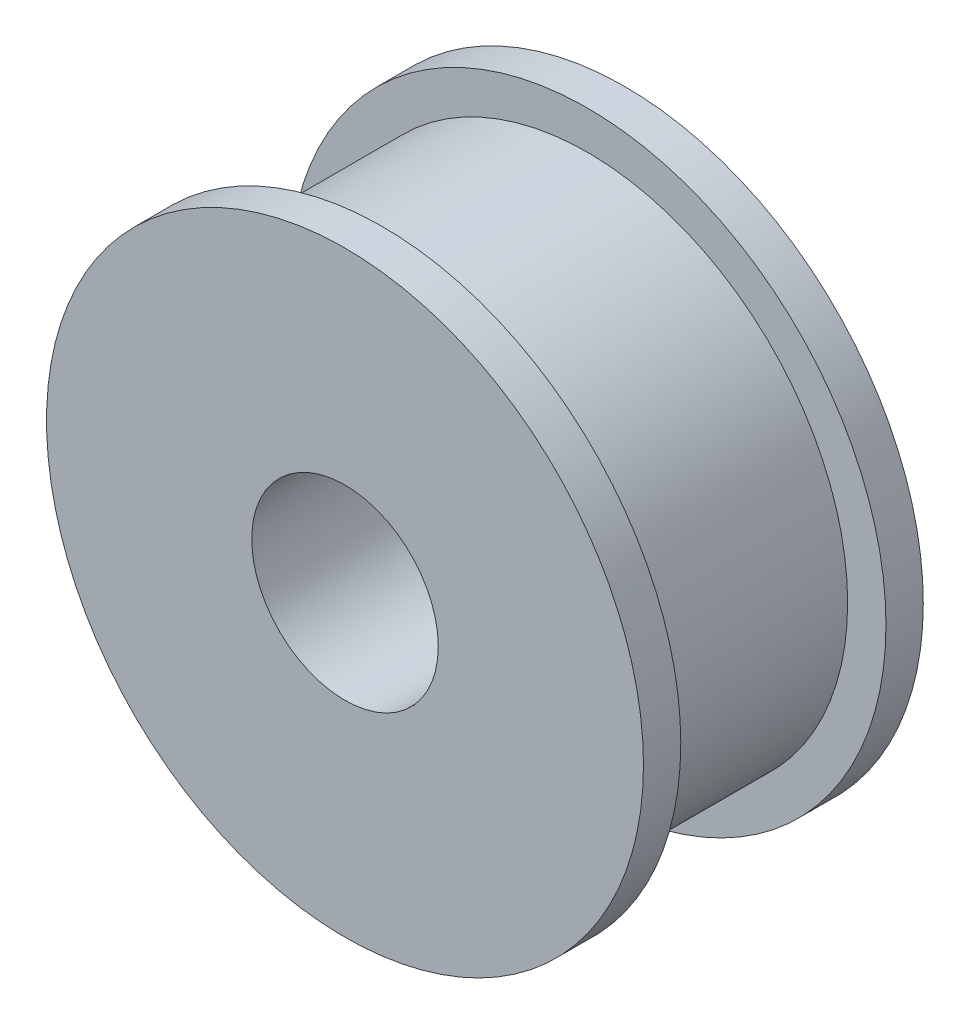
ISO-10303-21;
HEADER;
FILE_DESCRIPTION(('STEP AP214'),'2;1');
FILE_NAME('part.step','',(''),(''),'','','');
FILE_SCHEMA(('AUTOMOTIVE_DESIGN { 1 0 10303 214 1 1 1 1 }'));
ENDSEC;
DATA;
#1=APPLICATION_CONTEXT('core data for automotive mechanical design processes');
#2=APPLICATION_PROTOCOL_DEFINITION('international standard','automotive_design',2000,#1);
#3=PRODUCT_CONTEXT('',#1,'mechanical');
#4=PRODUCT('Part','Part','',(#3));
#5=PRODUCT_RELATED_PRODUCT_CATEGORY('part','',(#4));
#6=PRODUCT_DEFINITION_FORMATION('','',#4);
#7=PRODUCT_DEFINITION_CONTEXT('part definition',#1,'design');
#8=PRODUCT_DEFINITION('design','',#6,#7);
#9=PRODUCT_DEFINITION_SHAPE('','',#8);
#10=(LENGTH_UNIT() NAMED_UNIT(*) SI_UNIT(.MILLI.,.METRE.));
#11=(NAMED_UNIT(*) PLANE_ANGLE_UNIT() SI_UNIT($,.RADIAN.));
#12=(NAMED_UNIT(*) SI_UNIT($,.STERADIAN.) SOLID_ANGLE_UNIT());
#13=UNCERTAINTY_MEASURE_WITH_UNIT(LENGTH_MEASURE(1.E-05),#10,'distance_accuracy_value','');
#14=(GEOMETRIC_REPRESENTATION_CONTEXT(3) GLOBAL_UNCERTAINTY_ASSIGNED_CONTEXT((#13)) GLOBAL_UNIT_ASSIGNED_CONTEXT((#10,
#11,#12)) REPRESENTATION_CONTEXT('',''));
#15=CARTESIAN_POINT('',(0.,0.,0.));
#16=DIRECTION('',(0.,0.,1.));
#17=DIRECTION('',(1.,0.,0.));
#18=AXIS2_PLACEMENT_3D('',#15,#16,#17);
#19=CARTESIAN_POINT('',(0.,0.,2.));
#20=DIRECTION('',(0.,0.,-1.));
#21=DIRECTION('',(-1.,0.,0.));
#22=AXIS2_PLACEMENT_3D('',#19,#20,#21);
#23=CYLINDRICAL_SURFACE('',#22,16.);
#24=CARTESIAN_POINT('',(0.,0.,2.));
#25=DIRECTION('',(0.,0.,1.));
#26=DIRECTION('',(1.,0.,0.));
#27=AXIS2_PLACEMENT_3D('',#24,#25,#26);
#28=CIRCLE('',#27,16.);
#29=CARTESIAN_POINT('',(16.,0.,2.));
#30=VERTEX_POINT('',#29);
#31=EDGE_CURVE('E39',#30,#30,#28,.T.);
#32=ORIENTED_EDGE('',*,*,#31,.F.);
#33=EDGE_LOOP('',(#32));
#34=FACE_BOUND('',#33,.T.);
#35=CARTESIAN_POINT('',(0.,0.,0.));
#36=DIRECTION('',(0.,0.,1.));
#37=DIRECTION('',(1.,0.,0.));
#38=AXIS2_PLACEMENT_3D('',#35,#36,#37);
#39=CIRCLE('',#38,16.);
#40=CARTESIAN_POINT('',(16.,0.,0.));
#41=VERTEX_POINT('',#40);
#42=EDGE_CURVE('E35',#41,#41,#39,.T.);
#43=ORIENTED_EDGE('',*,*,#42,.T.);
#44=EDGE_LOOP('',(#43));
#45=FACE_BOUND('',#44,.T.);
#46=ADVANCED_FACE('F32',(#34,#45),#23,.T.);
#47=CARTESIAN_POINT('',(0.,0.,2.));
#48=DIRECTION('',(0.,0.,1.));
#49=DIRECTION('',(1.,0.,0.));
#50=AXIS2_PLACEMENT_3D('',#47,#48,#49);
#51=PLANE('',#50);
#52=CARTESIAN_POINT('',(0.,0.,2.));
#53=DIRECTION('',(0.,0.,1.));
#54=DIRECTION('',(1.,0.,0.));
#55=AXIS2_PLACEMENT_3D('',#52,#53,#54);
#56=CIRCLE('',#55,13.945);
#57=CARTESIAN_POINT('',(13.945,0.,2.));
#58=VERTEX_POINT('',#57);
#59=EDGE_CURVE('E10',#58,#58,#56,.T.);
#60=ORIENTED_EDGE('',*,*,#59,.F.);
#61=EDGE_LOOP('',(#60));
#62=FACE_BOUND('',#61,.T.);
#63=ORIENTED_EDGE('',*,*,#31,.T.);
#64=EDGE_LOOP('',(#63));
#65=FACE_BOUND('',#64,.T.);
#66=ADVANCED_FACE('F90',(#62,#65),#51,.T.);
#67=CARTESIAN_POINT('',(0.,0.,0.));
#68=DIRECTION('',(0.,0.,1.));
#69=DIRECTION('',(1.,0.,0.));
#70=AXIS2_PLACEMENT_3D('',#67,#68,#69);
#71=PLANE('',#70);
#72=CARTESIAN_POINT('',(0.,0.,0.));
#73=DIRECTION('',(0.,0.,1.));
#74=DIRECTION('',(1.,0.,0.));
#75=AXIS2_PLACEMENT_3D('',#72,#73,#74);
#76=CIRCLE('',#75,5.);
#77=CARTESIAN_POINT('',(5.,0.,0.));
#78=VERTEX_POINT('',#77);
#79=EDGE_CURVE('E52',#78,#78,#76,.T.);
#80=ORIENTED_EDGE('',*,*,#79,.T.);
#81=EDGE_LOOP('',(#80));
#82=FACE_BOUND('',#81,.T.);
#83=ORIENTED_EDGE('',*,*,#42,.F.);
#84=EDGE_LOOP('',(#83));
#85=FACE_BOUND('',#84,.T.);
#86=ADVANCED_FACE('F61',(#82,#85),#71,.F.);
#87=CARTESIAN_POINT('',(0.,0.,13.));
#88=DIRECTION('',(0.,0.,-1.));
#89=DIRECTION('',(-1.,0.,0.));
#90=AXIS2_PLACEMENT_3D('',#87,#88,#89);
#91=CYLINDRICAL_SURFACE('',#90,13.945);
#92=CARTESIAN_POINT('',(0.,0.,13.));
#93=DIRECTION('',(0.,0.,1.));
#94=DIRECTION('',(1.,0.,0.));
#95=AXIS2_PLACEMENT_3D('',#92,#93,#94);
#96=CIRCLE('',#95,13.945);
#97=CARTESIAN_POINT('',(13.945,0.,13.));
#98=VERTEX_POINT('',#97);
#99=EDGE_CURVE('E45',#98,#98,#96,.T.);
#100=ORIENTED_EDGE('',*,*,#99,.F.);
#101=EDGE_LOOP('',(#100));
#102=FACE_BOUND('',#101,.T.);
#103=ORIENTED_EDGE('',*,*,#59,.T.);
#104=EDGE_LOOP('',(#103));
#105=FACE_BOUND('',#104,.T.);
#106=ADVANCED_FACE('F80',(#102,#105),#91,.T.);
#107=CARTESIAN_POINT('',(0.,0.,15.));
#108=DIRECTION('',(0.,0.,-1.));
#109=DIRECTION('',(-1.,0.,0.));
#110=AXIS2_PLACEMENT_3D('',#107,#108,#109);
#111=CYLINDRICAL_SURFACE('',#110,16.);
#112=CARTESIAN_POINT('',(0.,0.,15.));
#113=DIRECTION('',(0.,0.,1.));
#114=DIRECTION('',(1.,0.,0.));
#115=AXIS2_PLACEMENT_3D('',#112,#113,#114);
#116=CIRCLE('',#115,16.);
#117=CARTESIAN_POINT('',(16.,0.,15.));
#118=VERTEX_POINT('',#117);
#119=EDGE_CURVE('E48',#118,#118,#116,.T.);
#120=ORIENTED_EDGE('',*,*,#119,.F.);
#121=EDGE_LOOP('',(#120));
#122=FACE_BOUND('',#121,.T.);
#123=CARTESIAN_POINT('',(0.,0.,13.));
#124=DIRECTION('',(0.,0.,1.));
#125=DIRECTION('',(1.,0.,0.));
#126=AXIS2_PLACEMENT_3D('',#123,#124,#125);
#127=CIRCLE('',#126,16.);
#128=CARTESIAN_POINT('',(16.,0.,13.));
#129=VERTEX_POINT('',#128);
#130=EDGE_CURVE('E49',#129,#129,#127,.T.);
#131=ORIENTED_EDGE('',*,*,#130,.T.);
#132=EDGE_LOOP('',(#131));
#133=FACE_BOUND('',#132,.T.);
#134=ADVANCED_FACE('F74',(#122,#133),#111,.T.);
#135=CARTESIAN_POINT('',(0.,0.,15.));
#136=DIRECTION('',(0.,0.,1.));
#137=DIRECTION('',(1.,0.,0.));
#138=AXIS2_PLACEMENT_3D('',#135,#136,#137);
#139=PLANE('',#138);
#140=CARTESIAN_POINT('',(0.,0.,15.));
#141=DIRECTION('',(0.,0.,1.));
#142=DIRECTION('',(1.,0.,0.));
#143=AXIS2_PLACEMENT_3D('',#140,#141,#142);
#144=CIRCLE('',#143,5.);
#145=CARTESIAN_POINT('',(5.,0.,15.));
#146=VERTEX_POINT('',#145);
#147=EDGE_CURVE('E55',#146,#146,#144,.T.);
#148=ORIENTED_EDGE('',*,*,#147,.F.);
#149=EDGE_LOOP('',(#148));
#150=FACE_BOUND('',#149,.T.);
#151=ORIENTED_EDGE('',*,*,#119,.T.);
#152=EDGE_LOOP('',(#151));
#153=FACE_BOUND('',#152,.T.);
#154=ADVANCED_FACE('F71',(#150,#153),#139,.T.);
#155=CARTESIAN_POINT('',(0.,0.,13.));
#156=DIRECTION('',(0.,0.,1.));
#157=DIRECTION('',(1.,0.,0.));
#158=AXIS2_PLACEMENT_3D('',#155,#156,#157);
#159=PLANE('',#158);
#160=ORIENTED_EDGE('',*,*,#99,.T.);
#161=EDGE_LOOP('',(#160));
#162=FACE_BOUND('',#161,.T.);
#163=ORIENTED_EDGE('',*,*,#130,.F.);
#164=EDGE_LOOP('',(#163));
#165=FACE_BOUND('',#164,.T.);
#166=ADVANCED_FACE('F67',(#162,#165),#159,.F.);
#167=CARTESIAN_POINT('',(0.,0.,0.));
#168=DIRECTION('',(0.,0.,1.));
#169=DIRECTION('',(1.,0.,0.));
#170=AXIS2_PLACEMENT_3D('',#167,#168,#169);
#171=CYLINDRICAL_SURFACE('',#170,5.);
#172=ORIENTED_EDGE('',*,*,#79,.F.);
#173=EDGE_LOOP('',(#172));
#174=FACE_BOUND('',#173,.T.);
#175=ORIENTED_EDGE('',*,*,#147,.T.);
#176=EDGE_LOOP('',(#175));
#177=FACE_BOUND('',#176,.T.);
#178=ADVANCED_FACE('F64',(#174,#177),#171,.F.);
#179=CLOSED_SHELL('',(#46,#66,#86,#106,#134,#154,#166,#178));
#180=MANIFOLD_SOLID_BREP('B2',#179);
#181=ADVANCED_BREP_SHAPE_REPRESENTATION('',(#18,#180),#14);
#182=SHAPE_DEFINITION_REPRESENTATION(#9,#181);
ENDSEC;
END-ISO-10303-21;
